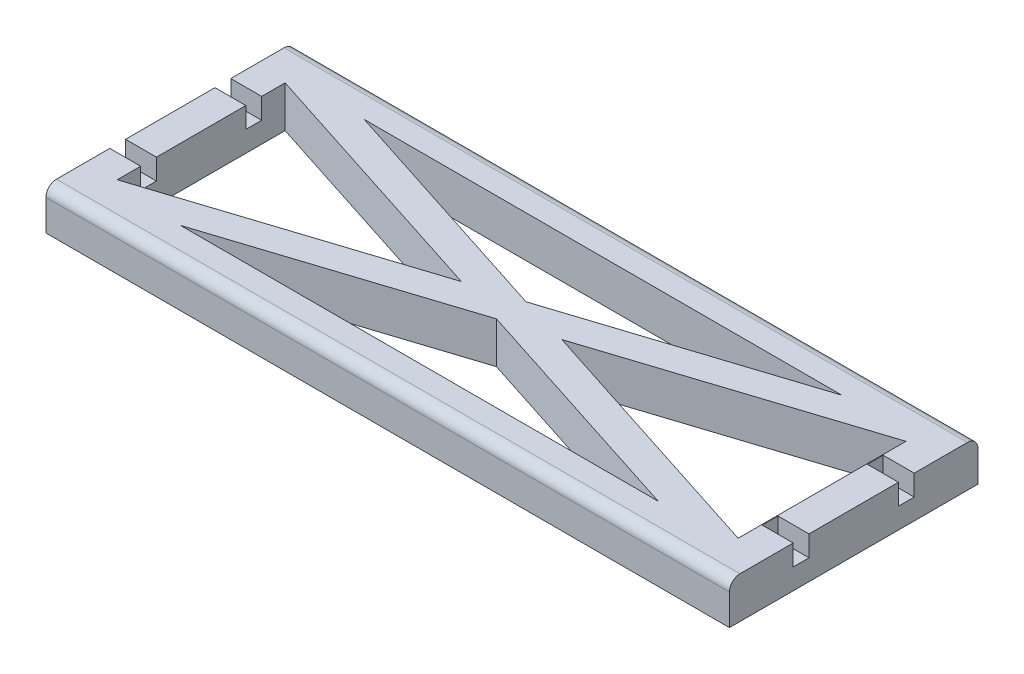
ISO-10303-21;
HEADER;
FILE_DESCRIPTION(('STEP AP214'),'2;1');
FILE_NAME('part.step','',(''),(''),'','','');
FILE_SCHEMA(('AUTOMOTIVE_DESIGN { 1 0 10303 214 1 1 1 1 }'));
ENDSEC;
DATA;
#1=APPLICATION_CONTEXT('core data for automotive mechanical design processes');
#2=APPLICATION_PROTOCOL_DEFINITION('international standard','automotive_design',2000,#1);
#3=PRODUCT_CONTEXT('',#1,'mechanical');
#4=PRODUCT('Part','Part','',(#3));
#5=PRODUCT_RELATED_PRODUCT_CATEGORY('part','',(#4));
#6=PRODUCT_DEFINITION_FORMATION('','',#4);
#7=PRODUCT_DEFINITION_CONTEXT('part definition',#1,'design');
#8=PRODUCT_DEFINITION('design','',#6,#7);
#9=PRODUCT_DEFINITION_SHAPE('','',#8);
#10=(LENGTH_UNIT() NAMED_UNIT(*) SI_UNIT(.MILLI.,.METRE.));
#11=(NAMED_UNIT(*) PLANE_ANGLE_UNIT() SI_UNIT($,.RADIAN.));
#12=(NAMED_UNIT(*) SI_UNIT($,.STERADIAN.) SOLID_ANGLE_UNIT());
#13=UNCERTAINTY_MEASURE_WITH_UNIT(LENGTH_MEASURE(1.E-05),#10,'distance_accuracy_value','');
#14=(GEOMETRIC_REPRESENTATION_CONTEXT(3) GLOBAL_UNCERTAINTY_ASSIGNED_CONTEXT((#13)) GLOBAL_UNIT_ASSIGNED_CONTEXT((#10,
#11,#12)) REPRESENTATION_CONTEXT('',''));
#15=CARTESIAN_POINT('',(0.,0.,0.));
#16=DIRECTION('',(0.,0.,1.));
#17=DIRECTION('',(1.,0.,0.));
#18=AXIS2_PLACEMENT_3D('',#15,#16,#17);
#19=CARTESIAN_POINT('',(82.5,10.,0.));
#20=DIRECTION('',(-1.,0.,0.));
#21=DIRECTION('',(0.,0.,1.));
#22=AXIS2_PLACEMENT_3D('',#19,#20,#21);
#23=PLANE('',#22);
#24=DIRECTION('',(0.,0.,-1.));
#25=VECTOR('',#24,1.);
#26=CARTESIAN_POINT('',(82.5,10.,0.));
#27=LINE('',#26,#25);
#28=CARTESIAN_POINT('',(82.5,10.,27.46));
#29=VERTEX_POINT('',#28);
#30=CARTESIAN_POINT('',(82.5,10.,14.605));
#31=VERTEX_POINT('',#30);
#32=EDGE_CURVE('E393',#29,#31,#27,.T.);
#33=ORIENTED_EDGE('',*,*,#32,.F.);
#34=CARTESIAN_POINT('',(82.5,7.46,27.46));
#35=DIRECTION('',(-1.,0.,0.));
#36=DIRECTION('',(0.,0.,1.));
#37=AXIS2_PLACEMENT_3D('',#34,#35,#36);
#38=CIRCLE('',#37,2.54);
#39=CARTESIAN_POINT('',(82.5,7.46,30.));
#40=VERTEX_POINT('',#39);
#41=EDGE_CURVE('E506',#29,#40,#38,.F.);
#42=ORIENTED_EDGE('',*,*,#41,.T.);
#43=DIRECTION('',(0.,-1.,0.));
#44=VECTOR('',#43,1.);
#45=CARTESIAN_POINT('',(82.5,10.,30.));
#46=LINE('',#45,#44);
#47=CARTESIAN_POINT('',(82.5,0.,30.));
#48=VERTEX_POINT('',#47);
#49=EDGE_CURVE('E464',#40,#48,#46,.T.);
#50=ORIENTED_EDGE('',*,*,#49,.T.);
#51=DIRECTION('',(0.,0.,-1.));
#52=VECTOR('',#51,1.);
#53=CARTESIAN_POINT('',(82.5,0.,0.));
#54=LINE('',#53,#52);
#55=CARTESIAN_POINT('',(82.5,0.,-30.));
#56=VERTEX_POINT('',#55);
#57=EDGE_CURVE('E436',#48,#56,#54,.T.);
#58=ORIENTED_EDGE('',*,*,#57,.T.);
#59=DIRECTION('',(0.,-1.,0.));
#60=VECTOR('',#59,1.);
#61=CARTESIAN_POINT('',(82.5,10.,-30.));
#62=LINE('',#61,#60);
#63=CARTESIAN_POINT('',(82.5,7.46,-30.));
#64=VERTEX_POINT('',#63);
#65=EDGE_CURVE('E459',#64,#56,#62,.T.);
#66=ORIENTED_EDGE('',*,*,#65,.F.);
#67=CARTESIAN_POINT('',(82.5,7.46,-27.46));
#68=DIRECTION('',(-1.,0.,0.));
#69=DIRECTION('',(0.,0.,1.));
#70=AXIS2_PLACEMENT_3D('',#67,#68,#69);
#71=CIRCLE('',#70,2.54);
#72=CARTESIAN_POINT('',(82.5,10.,-27.46));
#73=VERTEX_POINT('',#72);
#74=EDGE_CURVE('E504',#64,#73,#71,.F.);
#75=ORIENTED_EDGE('',*,*,#74,.T.);
#76=CARTESIAN_POINT('',(82.5,10.,-14.605));
#77=VERTEX_POINT('',#76);
#78=EDGE_CURVE('E392',#77,#73,#27,.T.);
#79=ORIENTED_EDGE('',*,*,#78,.F.);
#80=DIRECTION('',(0.,-1.,0.));
#81=VECTOR('',#80,1.);
#82=CARTESIAN_POINT('',(82.5,10.,-14.605));
#83=LINE('',#82,#81);
#84=CARTESIAN_POINT('',(82.5,5.,-14.605));
#85=VERTEX_POINT('',#84);
#86=EDGE_CURVE('E285',#77,#85,#83,.T.);
#87=ORIENTED_EDGE('',*,*,#86,.T.);
#88=DIRECTION('',(0.,0.,1.));
#89=VECTOR('',#88,1.);
#90=CARTESIAN_POINT('',(82.5,5.,-10.795));
#91=LINE('',#90,#89);
#92=CARTESIAN_POINT('',(82.5,5.,-10.795));
#93=VERTEX_POINT('',#92);
#94=EDGE_CURVE('E288',#85,#93,#91,.T.);
#95=ORIENTED_EDGE('',*,*,#94,.T.);
#96=DIRECTION('',(0.,1.,0.));
#97=VECTOR('',#96,1.);
#98=CARTESIAN_POINT('',(82.5,5.,-10.795));
#99=LINE('',#98,#97);
#100=CARTESIAN_POINT('',(82.5,10.,-10.795));
#101=VERTEX_POINT('',#100);
#102=EDGE_CURVE('E279',#93,#101,#99,.T.);
#103=ORIENTED_EDGE('',*,*,#102,.T.);
#104=CARTESIAN_POINT('',(82.5,10.,10.795));
#105=VERTEX_POINT('',#104);
#106=EDGE_CURVE('E396',#105,#101,#27,.T.);
#107=ORIENTED_EDGE('',*,*,#106,.F.);
#108=DIRECTION('',(0.,-1.,0.));
#109=VECTOR('',#108,1.);
#110=CARTESIAN_POINT('',(82.5,10.,10.795));
#111=LINE('',#110,#109);
#112=CARTESIAN_POINT('',(82.5,5.,10.795));
#113=VERTEX_POINT('',#112);
#114=EDGE_CURVE('E307',#105,#113,#111,.T.);
#115=ORIENTED_EDGE('',*,*,#114,.T.);
#116=DIRECTION('',(0.,0.,1.));
#117=VECTOR('',#116,1.);
#118=CARTESIAN_POINT('',(82.5,5.,14.605));
#119=LINE('',#118,#117);
#120=CARTESIAN_POINT('',(82.5,5.,14.605));
#121=VERTEX_POINT('',#120);
#122=EDGE_CURVE('E318',#113,#121,#119,.T.);
#123=ORIENTED_EDGE('',*,*,#122,.T.);
#124=DIRECTION('',(0.,1.,0.));
#125=VECTOR('',#124,1.);
#126=CARTESIAN_POINT('',(82.5,10.,14.605));
#127=LINE('',#126,#125);
#128=EDGE_CURVE('E315',#121,#31,#127,.T.);
#129=ORIENTED_EDGE('',*,*,#128,.T.);
#130=EDGE_LOOP('',(#33,#42,#50,#58,#66,#75,#79,#87,#95,#103,#107,#115,#123,#129));
#131=FACE_BOUND('',#130,.T.);
#132=ADVANCED_FACE('F41',(#131),#23,.F.);
#133=CARTESIAN_POINT('',(0.,10.,0.));
#134=DIRECTION('',(0.,1.,0.));
#135=DIRECTION('',(0.,0.,1.));
#136=AXIS2_PLACEMENT_3D('',#133,#134,#135);
#137=PLANE('',#136);
#138=DIRECTION('',(1.,0.,0.));
#139=VECTOR('',#138,1.);
#140=CARTESIAN_POINT('',(0.,10.,22.1658349914552));
#141=LINE('',#140,#139);
#142=CARTESIAN_POINT('',(-57.8346231707164,10.,22.1658349914552));
#143=VERTEX_POINT('',#142);
#144=CARTESIAN_POINT('',(57.4604582637845,10.,22.1658349914552));
#145=VERTEX_POINT('',#144);
#146=EDGE_CURVE('E367',#143,#145,#141,.T.);
#147=ORIENTED_EDGE('',*,*,#146,.F.);
#148=DIRECTION('',(0.951708617760551,0.,-0.307002779922759));
#149=VECTOR('',#148,1.);
#150=CARTESIAN_POINT('',(1.02539729526811,10.,3.17873161533114));
#151=LINE('',#150,#149);
#152=CARTESIAN_POINT('',(-0.187082453465993,10.,3.56985411492279));
#153=VERTEX_POINT('',#152);
#154=EDGE_CURVE('E370',#143,#153,#151,.T.);
#155=ORIENTED_EDGE('',*,*,#154,.T.);
#156=DIRECTION('',(0.951708617760551,0.,0.307002779922758));
#157=VECTOR('',#156,1.);
#158=CARTESIAN_POINT('',(-1.06066260223625,10.,3.28805406693238));
#159=LINE('',#158,#157);
#160=EDGE_CURVE('E373',#153,#145,#159,.T.);
#161=ORIENTED_EDGE('',*,*,#160,.T.);
#162=EDGE_LOOP('',(#147,#155,#161));
#163=FACE_BOUND('',#162,.T.);
#164=DIRECTION('',(-0.951708617760551,0.,0.307002779922759));
#165=VECTOR('',#164,1.);
#166=CARTESIAN_POINT('',(1.13471977655831,10.,3.51763130733076));
#167=LINE('',#166,#165);
#168=CARTESIAN_POINT('',(74.8529175465339,10.,-20.2624324894356));
#169=VERTEX_POINT('',#168);
#170=CARTESIAN_POINT('',(12.0393768292836,10.,0.));
#171=VERTEX_POINT('',#170);
#172=EDGE_CURVE('E375',#169,#171,#167,.T.);
#173=ORIENTED_EDGE('',*,*,#172,.F.);
#174=DIRECTION('',(0.,0.,1.));
#175=VECTOR('',#174,1.);
#176=CARTESIAN_POINT('',(74.8529175465339,10.,0.));
#177=LINE('',#176,#175);
#178=CARTESIAN_POINT('',(74.8529175465339,10.,20.2624324894356));
#179=VERTEX_POINT('',#178);
#180=EDGE_CURVE('E378',#169,#179,#177,.T.);
#181=ORIENTED_EDGE('',*,*,#180,.T.);
#182=DIRECTION('',(-0.951708617760551,0.,-0.307002779922759));
#183=VECTOR('',#182,1.);
#184=CARTESIAN_POINT('',(1.13471977655831,10.,-3.51763130733077));
#185=LINE('',#184,#183);
#186=EDGE_CURVE('E381',#179,#171,#185,.T.);
#187=ORIENTED_EDGE('',*,*,#186,.T.);
#188=EDGE_LOOP('',(#173,#181,#187));
#189=FACE_BOUND('',#188,.T.);
#190=DIRECTION('',(0.951708617760551,0.,-0.307002779922758));
#191=VECTOR('',#190,1.);
#192=CARTESIAN_POINT('',(-1.06066260223625,10.,-3.28805406693238));
#193=LINE('',#192,#191);
#194=CARTESIAN_POINT('',(-0.187082453465989,10.,-3.56985411492279));
#195=VERTEX_POINT('',#194);
#196=CARTESIAN_POINT('',(57.4604582637846,10.,-22.1658349914552));
#197=VERTEX_POINT('',#196);
#198=EDGE_CURVE('E383',#195,#197,#193,.T.);
#199=ORIENTED_EDGE('',*,*,#198,.F.);
#200=DIRECTION('',(0.951708617760551,0.,0.307002779922759));
#201=VECTOR('',#200,1.);
#202=CARTESIAN_POINT('',(1.02539729526811,10.,-3.17873161533114));
#203=LINE('',#202,#201);
#204=CARTESIAN_POINT('',(-57.8346231707164,10.,-22.1658349914552));
#205=VERTEX_POINT('',#204);
#206=EDGE_CURVE('E386',#205,#195,#203,.T.);
#207=ORIENTED_EDGE('',*,*,#206,.F.);
#208=DIRECTION('',(-1.,0.,0.));
#209=VECTOR('',#208,1.);
#210=CARTESIAN_POINT('',(0.,10.,-22.1658349914552));
#211=LINE('',#210,#209);
#212=EDGE_CURVE('E389',#197,#205,#211,.T.);
#213=ORIENTED_EDGE('',*,*,#212,.F.);
#214=EDGE_LOOP('',(#199,#207,#213));
#215=FACE_BOUND('',#214,.T.);
#216=DIRECTION('',(0.,0.,1.));
#217=VECTOR('',#216,1.);
#218=CARTESIAN_POINT('',(-82.5,10.,0.));
#219=LINE('',#218,#217);
#220=CARTESIAN_POINT('',(-82.5,10.,14.605));
#221=VERTEX_POINT('',#220);
#222=CARTESIAN_POINT('',(-82.5,10.,27.46));
#223=VERTEX_POINT('',#222);
#224=EDGE_CURVE('E395',#221,#223,#219,.T.);
#225=ORIENTED_EDGE('',*,*,#224,.T.);
#226=DIRECTION('',(1.,0.,0.));
#227=VECTOR('',#226,1.);
#228=CARTESIAN_POINT('',(82.5,10.,27.46));
#229=LINE('',#228,#227);
#230=EDGE_CURVE('E501',#223,#29,#229,.T.);
#231=ORIENTED_EDGE('',*,*,#230,.T.);
#232=ORIENTED_EDGE('',*,*,#32,.T.);
#233=DIRECTION('',(1.,0.,0.));
#234=VECTOR('',#233,1.);
#235=CARTESIAN_POINT('',(75.,10.,14.605));
#236=LINE('',#235,#234);
#237=CARTESIAN_POINT('',(75.,10.,14.605));
#238=VERTEX_POINT('',#237);
#239=EDGE_CURVE('E294',#238,#31,#236,.T.);
#240=ORIENTED_EDGE('',*,*,#239,.F.);
#241=DIRECTION('',(0.,0.,-1.));
#242=VECTOR('',#241,1.);
#243=CARTESIAN_POINT('',(75.,10.,14.605));
#244=LINE('',#243,#242);
#245=CARTESIAN_POINT('',(75.,10.,10.795));
#246=VERTEX_POINT('',#245);
#247=EDGE_CURVE('E311',#238,#246,#244,.T.);
#248=ORIENTED_EDGE('',*,*,#247,.T.);
#249=DIRECTION('',(1.,0.,0.));
#250=VECTOR('',#249,1.);
#251=CARTESIAN_POINT('',(75.,10.,10.795));
#252=LINE('',#251,#250);
#253=EDGE_CURVE('E325',#246,#105,#252,.T.);
#254=ORIENTED_EDGE('',*,*,#253,.T.);
#255=ORIENTED_EDGE('',*,*,#106,.T.);
#256=DIRECTION('',(1.,0.,0.));
#257=VECTOR('',#256,1.);
#258=CARTESIAN_POINT('',(75.,10.,-10.795));
#259=LINE('',#258,#257);
#260=CARTESIAN_POINT('',(75.,10.,-10.795));
#261=VERTEX_POINT('',#260);
#262=EDGE_CURVE('E296',#261,#101,#259,.T.);
#263=ORIENTED_EDGE('',*,*,#262,.F.);
#264=DIRECTION('',(0.,0.,-1.));
#265=VECTOR('',#264,1.);
#266=CARTESIAN_POINT('',(75.,10.,-14.605));
#267=LINE('',#266,#265);
#268=CARTESIAN_POINT('',(75.,10.,-14.605));
#269=VERTEX_POINT('',#268);
#270=EDGE_CURVE('E281',#261,#269,#267,.T.);
#271=ORIENTED_EDGE('',*,*,#270,.T.);
#272=DIRECTION('',(1.,0.,0.));
#273=VECTOR('',#272,1.);
#274=CARTESIAN_POINT('',(75.,10.,-14.605));
#275=LINE('',#274,#273);
#276=EDGE_CURVE('E299',#269,#77,#275,.T.);
#277=ORIENTED_EDGE('',*,*,#276,.T.);
#278=ORIENTED_EDGE('',*,*,#78,.T.);
#279=DIRECTION('',(-1.,0.,0.));
#280=VECTOR('',#279,1.);
#281=CARTESIAN_POINT('',(-82.5,10.,-27.46));
#282=LINE('',#281,#280);
#283=CARTESIAN_POINT('',(-82.5,10.,-27.46));
#284=VERTEX_POINT('',#283);
#285=EDGE_CURVE('E498',#73,#284,#282,.T.);
#286=ORIENTED_EDGE('',*,*,#285,.T.);
#287=CARTESIAN_POINT('',(-82.5,10.,-14.605));
#288=VERTEX_POINT('',#287);
#289=EDGE_CURVE('E397',#284,#288,#219,.T.);
#290=ORIENTED_EDGE('',*,*,#289,.T.);
#291=DIRECTION('',(-1.,0.,0.));
#292=VECTOR('',#291,1.);
#293=CARTESIAN_POINT('',(0.,10.,-14.605));
#294=LINE('',#293,#292);
#295=CARTESIAN_POINT('',(-75.04,10.,-14.605));
#296=VERTEX_POINT('',#295);
#297=EDGE_CURVE('E493',#296,#288,#294,.T.);
#298=ORIENTED_EDGE('',*,*,#297,.F.);
#299=DIRECTION('',(0.,0.,1.));
#300=VECTOR('',#299,1.);
#301=CARTESIAN_POINT('',(-75.04,10.,0.));
#302=LINE('',#301,#300);
#303=CARTESIAN_POINT('',(-75.04,10.,-20.2624324894356));
#304=VERTEX_POINT('',#303);
#305=EDGE_CURVE('E401',#304,#296,#302,.T.);
#306=ORIENTED_EDGE('',*,*,#305,.F.);
#307=DIRECTION('',(0.951708617760551,0.,0.307002779922758));
#308=VECTOR('',#307,1.);
#309=CARTESIAN_POINT('',(-1.15235243004238,10.,3.57229253313137));
#310=LINE('',#309,#308);
#311=CARTESIAN_POINT('',(-12.2264592827496,10.,0.));
#312=VERTEX_POINT('',#311);
#313=EDGE_CURVE('E404',#304,#312,#310,.T.);
#314=ORIENTED_EDGE('',*,*,#313,.T.);
#315=DIRECTION('',(0.951708617760551,0.,-0.307002779922759));
#316=VECTOR('',#315,1.);
#317=CARTESIAN_POINT('',(-1.15235243004238,10.,-3.57229253313138));
#318=LINE('',#317,#316);
#319=CARTESIAN_POINT('',(-75.04,10.,20.2624324894356));
#320=VERTEX_POINT('',#319);
#321=EDGE_CURVE('E407',#320,#312,#318,.T.);
#322=ORIENTED_EDGE('',*,*,#321,.F.);
#323=CARTESIAN_POINT('',(-75.04,10.,14.605));
#324=VERTEX_POINT('',#323);
#325=EDGE_CURVE('E399',#324,#320,#302,.T.);
#326=ORIENTED_EDGE('',*,*,#325,.F.);
#327=DIRECTION('',(1.,0.,0.));
#328=VECTOR('',#327,1.);
#329=CARTESIAN_POINT('',(0.,10.,14.605));
#330=LINE('',#329,#328);
#331=EDGE_CURVE('E491',#221,#324,#330,.T.);
#332=ORIENTED_EDGE('',*,*,#331,.F.);
#333=EDGE_LOOP('',(#225,#231,#232,#240,#248,#254,#255,#263,#271,#277,#278,#286,#290,#298,#306,
#314,#322,#326,#332));
#334=FACE_BOUND('',#333,.T.);
#335=ADVANCED_FACE('F518',(#163,#189,#215,#334),#137,.T.);
#336=DIRECTION('',(1.,0.,0.));
#337=VECTOR('',#336,1.);
#338=CARTESIAN_POINT('',(0.,10.,-10.795));
#339=LINE('',#338,#337);
#340=CARTESIAN_POINT('',(-82.5,10.,-10.795));
#341=VERTEX_POINT('',#340);
#342=CARTESIAN_POINT('',(-75.04,10.,-10.795));
#343=VERTEX_POINT('',#342);
#344=EDGE_CURVE('E496',#341,#343,#339,.T.);
#345=ORIENTED_EDGE('',*,*,#344,.F.);
#346=CARTESIAN_POINT('',(-82.5,10.,10.795));
#347=VERTEX_POINT('',#346);
#348=EDGE_CURVE('E400',#341,#347,#219,.T.);
#349=ORIENTED_EDGE('',*,*,#348,.T.);
#350=DIRECTION('',(-1.,0.,0.));
#351=VECTOR('',#350,1.);
#352=CARTESIAN_POINT('',(0.,10.,10.795));
#353=LINE('',#352,#351);
#354=CARTESIAN_POINT('',(-75.04,10.,10.795));
#355=VERTEX_POINT('',#354);
#356=EDGE_CURVE('E463',#355,#347,#353,.T.);
#357=ORIENTED_EDGE('',*,*,#356,.F.);
#358=EDGE_CURVE('E405',#343,#355,#302,.T.);
#359=ORIENTED_EDGE('',*,*,#358,.F.);
#360=EDGE_LOOP('',(#345,#349,#357,#359));
#361=FACE_BOUND('',#360,.T.);
#362=ADVANCED_FACE('F586',(#361),#137,.T.);
#363=CARTESIAN_POINT('',(-75.04,10.,0.));
#364=DIRECTION('',(1.,0.,0.));
#365=DIRECTION('',(0.,0.,-1.));
#366=AXIS2_PLACEMENT_3D('',#363,#364,#365);
#367=PLANE('',#366);
#368=DIRECTION('',(0.,-1.,0.));
#369=VECTOR('',#368,1.);
#370=CARTESIAN_POINT('',(-75.04,10.,-10.795));
#371=LINE('',#370,#369);
#372=CARTESIAN_POINT('',(-75.04,5.,-10.795));
#373=VERTEX_POINT('',#372);
#374=EDGE_CURVE('E360',#343,#373,#371,.T.);
#375=ORIENTED_EDGE('',*,*,#374,.F.);
#376=ORIENTED_EDGE('',*,*,#358,.T.);
#377=DIRECTION('',(0.,1.,0.));
#378=VECTOR('',#377,1.);
#379=CARTESIAN_POINT('',(-75.04,10.,10.795));
#380=LINE('',#379,#378);
#381=CARTESIAN_POINT('',(-75.04,5.,10.795));
#382=VERTEX_POINT('',#381);
#383=EDGE_CURVE('E343',#382,#355,#380,.T.);
#384=ORIENTED_EDGE('',*,*,#383,.F.);
#385=DIRECTION('',(0.,0.,-1.));
#386=VECTOR('',#385,1.);
#387=CARTESIAN_POINT('',(-75.04,5.,0.));
#388=LINE('',#387,#386);
#389=CARTESIAN_POINT('',(-75.04,5.,14.605));
#390=VERTEX_POINT('',#389);
#391=EDGE_CURVE('E362',#390,#382,#388,.T.);
#392=ORIENTED_EDGE('',*,*,#391,.F.);
#393=DIRECTION('',(0.,-1.,0.));
#394=VECTOR('',#393,1.);
#395=CARTESIAN_POINT('',(-75.04,10.,14.605));
#396=LINE('',#395,#394);
#397=EDGE_CURVE('E356',#324,#390,#396,.T.);
#398=ORIENTED_EDGE('',*,*,#397,.F.);
#399=ORIENTED_EDGE('',*,*,#325,.T.);
#400=DIRECTION('',(0.,-1.,0.));
#401=VECTOR('',#400,1.);
#402=CARTESIAN_POINT('',(-75.04,10.,20.2624324894356));
#403=LINE('',#402,#401);
#404=CARTESIAN_POINT('',(-75.04,0.,20.2624324894356));
#405=VERTEX_POINT('',#404);
#406=EDGE_CURVE('E456',#320,#405,#403,.T.);
#407=ORIENTED_EDGE('',*,*,#406,.T.);
#408=DIRECTION('',(0.,0.,1.));
#409=VECTOR('',#408,1.);
#410=CARTESIAN_POINT('',(-75.04,0.,0.));
#411=LINE('',#410,#409);
#412=CARTESIAN_POINT('',(-75.04,0.,-20.2624324894356));
#413=VERTEX_POINT('',#412);
#414=EDGE_CURVE('E448',#413,#405,#411,.T.);
#415=ORIENTED_EDGE('',*,*,#414,.F.);
#416=DIRECTION('',(0.,-1.,0.));
#417=VECTOR('',#416,1.);
#418=CARTESIAN_POINT('',(-75.04,10.,-20.2624324894356));
#419=LINE('',#418,#417);
#420=EDGE_CURVE('E461',#304,#413,#419,.T.);
#421=ORIENTED_EDGE('',*,*,#420,.F.);
#422=ORIENTED_EDGE('',*,*,#305,.T.);
#423=DIRECTION('',(0.,1.,0.));
#424=VECTOR('',#423,1.);
#425=CARTESIAN_POINT('',(-75.04,10.,-14.605));
#426=LINE('',#425,#424);
#427=CARTESIAN_POINT('',(-75.04,5.,-14.605));
#428=VERTEX_POINT('',#427);
#429=EDGE_CURVE('E358',#428,#296,#426,.T.);
#430=ORIENTED_EDGE('',*,*,#429,.F.);
#431=DIRECTION('',(0.,0.,-1.));
#432=VECTOR('',#431,1.);
#433=CARTESIAN_POINT('',(-75.04,5.,0.));
#434=LINE('',#433,#432);
#435=EDGE_CURVE('E364',#373,#428,#434,.T.);
#436=ORIENTED_EDGE('',*,*,#435,.F.);
#437=EDGE_LOOP('',(#375,#376,#384,#392,#398,#399,#407,#415,#421,#422,#430,#436));
#438=FACE_BOUND('',#437,.T.);
#439=ADVANCED_FACE('F550',(#438),#367,.T.);
#440=CARTESIAN_POINT('',(-1.15235243004238,10.,3.57229253313137));
#441=DIRECTION('',(0.307002779922758,0.,-0.951708617760551));
#442=DIRECTION('',(-0.951708617760551,0.,-0.307002779922758));
#443=AXIS2_PLACEMENT_3D('',#440,#441,#442);
#444=PLANE('',#443);
#445=DIRECTION('',(0.951708617760551,0.,0.307002779922758));
#446=VECTOR('',#445,1.);
#447=CARTESIAN_POINT('',(-1.15235243004238,0.,3.57229253313137));
#448=LINE('',#447,#446);
#449=CARTESIAN_POINT('',(-12.2264592827496,0.,0.));
#450=VERTEX_POINT('',#449);
#451=EDGE_CURVE('E451',#413,#450,#448,.T.);
#452=ORIENTED_EDGE('',*,*,#451,.T.);
#453=DIRECTION('',(0.,-1.,0.));
#454=VECTOR('',#453,1.);
#455=CARTESIAN_POINT('',(-12.2264592827496,10.,0.));
#456=LINE('',#455,#454);
#457=EDGE_CURVE('E458',#312,#450,#456,.T.);
#458=ORIENTED_EDGE('',*,*,#457,.F.);
#459=ORIENTED_EDGE('',*,*,#313,.F.);
#460=ORIENTED_EDGE('',*,*,#420,.T.);
#461=EDGE_LOOP('',(#452,#458,#459,#460));
#462=FACE_BOUND('',#461,.T.);
#463=ADVANCED_FACE('F557',(#462),#444,.F.);
#464=CARTESIAN_POINT('',(0.,10.,-30.));
#465=DIRECTION('',(0.,0.,1.));
#466=DIRECTION('',(1.,0.,0.));
#467=AXIS2_PLACEMENT_3D('',#464,#465,#466);
#468=PLANE('',#467);
#469=DIRECTION('',(0.,-1.,0.));
#470=VECTOR('',#469,1.);
#471=CARTESIAN_POINT('',(-82.5,10.,-30.));
#472=LINE('',#471,#470);
#473=CARTESIAN_POINT('',(-82.5,7.46,-30.));
#474=VERTEX_POINT('',#473);
#475=CARTESIAN_POINT('',(-82.5,0.,-30.));
#476=VERTEX_POINT('',#475);
#477=EDGE_CURVE('E469',#474,#476,#472,.T.);
#478=ORIENTED_EDGE('',*,*,#477,.F.);
#479=DIRECTION('',(-1.,0.,0.));
#480=VECTOR('',#479,1.);
#481=CARTESIAN_POINT('',(82.5,7.46,-30.));
#482=LINE('',#481,#480);
#483=EDGE_CURVE('E11',#474,#64,#482,.F.);
#484=ORIENTED_EDGE('',*,*,#483,.T.);
#485=ORIENTED_EDGE('',*,*,#65,.T.);
#486=DIRECTION('',(-1.,0.,0.));
#487=VECTOR('',#486,1.);
#488=CARTESIAN_POINT('',(0.,0.,-30.));
#489=LINE('',#488,#487);
#490=EDGE_CURVE('E439',#56,#476,#489,.T.);
#491=ORIENTED_EDGE('',*,*,#490,.T.);
#492=EDGE_LOOP('',(#478,#484,#485,#491));
#493=FACE_BOUND('',#492,.T.);
#494=ADVANCED_FACE('F590',(#493),#468,.F.);
#495=CARTESIAN_POINT('',(-82.5,10.,0.));
#496=DIRECTION('',(1.,0.,0.));
#497=DIRECTION('',(0.,0.,-1.));
#498=AXIS2_PLACEMENT_3D('',#495,#496,#497);
#499=PLANE('',#498);
#500=DIRECTION('',(0.,-1.,0.));
#501=VECTOR('',#500,1.);
#502=CARTESIAN_POINT('',(-82.5,10.,30.));
#503=LINE('',#502,#501);
#504=CARTESIAN_POINT('',(-82.5,7.46,30.));
#505=VERTEX_POINT('',#504);
#506=CARTESIAN_POINT('',(-82.5,0.,30.));
#507=VERTEX_POINT('',#506);
#508=EDGE_CURVE('E466',#505,#507,#503,.T.);
#509=ORIENTED_EDGE('',*,*,#508,.F.);
#510=CARTESIAN_POINT('',(-82.5,7.46,27.46));
#511=DIRECTION('',(1.,0.,0.));
#512=DIRECTION('',(0.,0.,-1.));
#513=AXIS2_PLACEMENT_3D('',#510,#511,#512);
#514=CIRCLE('',#513,2.54);
#515=EDGE_CURVE('E49',#505,#223,#514,.F.);
#516=ORIENTED_EDGE('',*,*,#515,.T.);
#517=ORIENTED_EDGE('',*,*,#224,.F.);
#518=DIRECTION('',(0.,1.,0.));
#519=VECTOR('',#518,1.);
#520=CARTESIAN_POINT('',(-82.5,10.,14.605));
#521=LINE('',#520,#519);
#522=CARTESIAN_POINT('',(-82.5,5.,14.605));
#523=VERTEX_POINT('',#522);
#524=EDGE_CURVE('E334',#523,#221,#521,.T.);
#525=ORIENTED_EDGE('',*,*,#524,.F.);
#526=DIRECTION('',(0.,0.,1.));
#527=VECTOR('',#526,1.);
#528=CARTESIAN_POINT('',(-82.5,5.,14.605));
#529=LINE('',#528,#527);
#530=CARTESIAN_POINT('',(-82.5,5.,10.795));
#531=VERTEX_POINT('',#530);
#532=EDGE_CURVE('E347',#531,#523,#529,.T.);
#533=ORIENTED_EDGE('',*,*,#532,.F.);
#534=DIRECTION('',(0.,-1.,0.));
#535=VECTOR('',#534,1.);
#536=CARTESIAN_POINT('',(-82.5,10.,10.795));
#537=LINE('',#536,#535);
#538=EDGE_CURVE('E351',#347,#531,#537,.T.);
#539=ORIENTED_EDGE('',*,*,#538,.F.);
#540=ORIENTED_EDGE('',*,*,#348,.F.);
#541=DIRECTION('',(0.,1.,0.));
#542=VECTOR('',#541,1.);
#543=CARTESIAN_POINT('',(-82.5,5.,-10.795));
#544=LINE('',#543,#542);
#545=CARTESIAN_POINT('',(-82.5,5.,-10.795));
#546=VERTEX_POINT('',#545);
#547=EDGE_CURVE('E331',#546,#341,#544,.T.);
#548=ORIENTED_EDGE('',*,*,#547,.F.);
#549=DIRECTION('',(0.,0.,1.));
#550=VECTOR('',#549,1.);
#551=CARTESIAN_POINT('',(-82.5,5.,-10.795));
#552=LINE('',#551,#550);
#553=CARTESIAN_POINT('',(-82.5,5.,-14.605));
#554=VERTEX_POINT('',#553);
#555=EDGE_CURVE('E337',#554,#546,#552,.T.);
#556=ORIENTED_EDGE('',*,*,#555,.F.);
#557=DIRECTION('',(0.,-1.,0.));
#558=VECTOR('',#557,1.);
#559=CARTESIAN_POINT('',(-82.5,10.,-14.605));
#560=LINE('',#559,#558);
#561=EDGE_CURVE('E333',#288,#554,#560,.T.);
#562=ORIENTED_EDGE('',*,*,#561,.F.);
#563=ORIENTED_EDGE('',*,*,#289,.F.);
#564=CARTESIAN_POINT('',(-82.5,7.46,-27.46));
#565=DIRECTION('',(1.,0.,0.));
#566=DIRECTION('',(0.,0.,-1.));
#567=AXIS2_PLACEMENT_3D('',#564,#565,#566);
#568=CIRCLE('',#567,2.54);
#569=EDGE_CURVE('E56',#284,#474,#568,.F.);
#570=ORIENTED_EDGE('',*,*,#569,.T.);
#571=ORIENTED_EDGE('',*,*,#477,.T.);
#572=DIRECTION('',(0.,0.,1.));
#573=VECTOR('',#572,1.);
#574=CARTESIAN_POINT('',(-82.5,0.,0.));
#575=LINE('',#574,#573);
#576=EDGE_CURVE('E442',#476,#507,#575,.T.);
#577=ORIENTED_EDGE('',*,*,#576,.T.);
#578=EDGE_LOOP('',(#509,#516,#517,#525,#533,#539,#540,#548,#556,#562,#563,#570,#571,#577));
#579=FACE_BOUND('',#578,.T.);
#580=ADVANCED_FACE('F512',(#579),#499,.F.);
#581=CARTESIAN_POINT('',(-1.06066260223625,10.,-3.28805406693238));
#582=DIRECTION('',(-0.307002779922758,0.,-0.951708617760551));
#583=DIRECTION('',(-0.951708617760551,0.,0.307002779922758));
#584=AXIS2_PLACEMENT_3D('',#581,#582,#583);
#585=PLANE('',#584);
#586=DIRECTION('',(0.951708617760551,0.,-0.307002779922758));
#587=VECTOR('',#586,1.);
#588=CARTESIAN_POINT('',(-1.06066260223625,0.,-3.28805406693238));
#589=LINE('',#588,#587);
#590=CARTESIAN_POINT('',(-0.187082453465989,0.,-3.56985411492279));
#591=VERTEX_POINT('',#590);
#592=CARTESIAN_POINT('',(57.4604582637846,0.,-22.1658349914552));
#593=VERTEX_POINT('',#592);
#594=EDGE_CURVE('E427',#591,#593,#589,.T.);
#595=ORIENTED_EDGE('',*,*,#594,.F.);
#596=DIRECTION('',(0.,-1.,0.));
#597=VECTOR('',#596,1.);
#598=CARTESIAN_POINT('',(-0.187082453465989,10.,-3.56985411492279));
#599=LINE('',#598,#597);
#600=EDGE_CURVE('E467',#195,#591,#599,.T.);
#601=ORIENTED_EDGE('',*,*,#600,.F.);
#602=ORIENTED_EDGE('',*,*,#198,.T.);
#603=DIRECTION('',(0.,-1.,0.));
#604=VECTOR('',#603,1.);
#605=CARTESIAN_POINT('',(57.4604582637846,10.,-22.1658349914552));
#606=LINE('',#605,#604);
#607=EDGE_CURVE('E472',#197,#593,#606,.T.);
#608=ORIENTED_EDGE('',*,*,#607,.T.);
#609=EDGE_LOOP('',(#595,#601,#602,#608));
#610=FACE_BOUND('',#609,.T.);
#611=ADVANCED_FACE('F601',(#610),#585,.T.);
#612=CARTESIAN_POINT('',(1.02539729526811,10.,-3.17873161533114));
#613=DIRECTION('',(0.307002779922759,0.,-0.951708617760551));
#614=DIRECTION('',(-0.951708617760551,0.,-0.307002779922759));
#615=AXIS2_PLACEMENT_3D('',#612,#613,#614);
#616=PLANE('',#615);
#617=DIRECTION('',(0.951708617760551,0.,0.307002779922759));
#618=VECTOR('',#617,1.);
#619=CARTESIAN_POINT('',(1.02539729526811,0.,-3.17873161533114));
#620=LINE('',#619,#618);
#621=CARTESIAN_POINT('',(-57.8346231707164,0.,-22.1658349914552));
#622=VERTEX_POINT('',#621);
#623=EDGE_CURVE('E430',#622,#591,#620,.T.);
#624=ORIENTED_EDGE('',*,*,#623,.F.);
#625=DIRECTION('',(0.,-1.,0.));
#626=VECTOR('',#625,1.);
#627=CARTESIAN_POINT('',(-57.8346231707164,10.,-22.1658349914552));
#628=LINE('',#627,#626);
#629=EDGE_CURVE('E474',#205,#622,#628,.T.);
#630=ORIENTED_EDGE('',*,*,#629,.F.);
#631=ORIENTED_EDGE('',*,*,#206,.T.);
#632=ORIENTED_EDGE('',*,*,#600,.T.);
#633=EDGE_LOOP('',(#624,#630,#631,#632));
#634=FACE_BOUND('',#633,.T.);
#635=ADVANCED_FACE('F597',(#634),#616,.T.);
#636=CARTESIAN_POINT('',(1.13471977655831,10.,3.51763130733076));
#637=DIRECTION('',(0.307002779922759,0.,0.951708617760551));
#638=DIRECTION('',(0.951708617760551,0.,-0.307002779922759));
#639=AXIS2_PLACEMENT_3D('',#636,#637,#638);
#640=PLANE('',#639);
#641=DIRECTION('',(-0.951708617760551,0.,0.307002779922759));
#642=VECTOR('',#641,1.);
#643=CARTESIAN_POINT('',(1.13471977655831,0.,3.51763130733076));
#644=LINE('',#643,#642);
#645=CARTESIAN_POINT('',(74.8529175465339,0.,-20.2624324894356));
#646=VERTEX_POINT('',#645);
#647=CARTESIAN_POINT('',(12.0393768292836,0.,0.));
#648=VERTEX_POINT('',#647);
#649=EDGE_CURVE('E418',#646,#648,#644,.T.);
#650=ORIENTED_EDGE('',*,*,#649,.F.);
#651=DIRECTION('',(0.,-1.,0.));
#652=VECTOR('',#651,1.);
#653=CARTESIAN_POINT('',(74.8529175465339,10.,-20.2624324894356));
#654=LINE('',#653,#652);
#655=EDGE_CURVE('E475',#169,#646,#654,.T.);
#656=ORIENTED_EDGE('',*,*,#655,.F.);
#657=ORIENTED_EDGE('',*,*,#172,.T.);
#658=DIRECTION('',(0.,-1.,0.));
#659=VECTOR('',#658,1.);
#660=CARTESIAN_POINT('',(12.0393768292836,10.,0.));
#661=LINE('',#660,#659);
#662=EDGE_CURVE('E478',#171,#648,#661,.T.);
#663=ORIENTED_EDGE('',*,*,#662,.T.);
#664=EDGE_LOOP('',(#650,#656,#657,#663));
#665=FACE_BOUND('',#664,.T.);
#666=ADVANCED_FACE('F600',(#665),#640,.T.);
#667=CARTESIAN_POINT('',(74.8529175465339,10.,0.));
#668=DIRECTION('',(1.,0.,0.));
#669=DIRECTION('',(0.,0.,-1.));
#670=AXIS2_PLACEMENT_3D('',#667,#668,#669);
#671=PLANE('',#670);
#672=DIRECTION('',(0.,0.,1.));
#673=VECTOR('',#672,1.);
#674=CARTESIAN_POINT('',(74.8529175465339,0.,0.));
#675=LINE('',#674,#673);
#676=CARTESIAN_POINT('',(74.8529175465339,0.,20.2624324894356));
#677=VERTEX_POINT('',#676);
#678=EDGE_CURVE('E421',#646,#677,#675,.T.);
#679=ORIENTED_EDGE('',*,*,#678,.T.);
#680=DIRECTION('',(0.,-1.,0.));
#681=VECTOR('',#680,1.);
#682=CARTESIAN_POINT('',(74.8529175465339,10.,20.2624324894356));
#683=LINE('',#682,#681);
#684=EDGE_CURVE('E480',#179,#677,#683,.T.);
#685=ORIENTED_EDGE('',*,*,#684,.F.);
#686=ORIENTED_EDGE('',*,*,#180,.F.);
#687=ORIENTED_EDGE('',*,*,#655,.T.);
#688=EDGE_LOOP('',(#679,#685,#686,#687));
#689=FACE_BOUND('',#688,.T.);
#690=ADVANCED_FACE('F609',(#689),#671,.F.);
#691=CARTESIAN_POINT('',(0.,10.,22.1658349914552));
#692=DIRECTION('',(0.,0.,-1.));
#693=DIRECTION('',(-1.,0.,0.));
#694=AXIS2_PLACEMENT_3D('',#691,#692,#693);
#695=PLANE('',#694);
#696=DIRECTION('',(1.,0.,0.));
#697=VECTOR('',#696,1.);
#698=CARTESIAN_POINT('',(0.,0.,22.1658349914552));
#699=LINE('',#698,#697);
#700=CARTESIAN_POINT('',(-57.8346231707164,0.,22.1658349914552));
#701=VERTEX_POINT('',#700);
#702=CARTESIAN_POINT('',(57.4604582637845,0.,22.1658349914552));
#703=VERTEX_POINT('',#702);
#704=EDGE_CURVE('E366',#701,#703,#699,.T.);
#705=ORIENTED_EDGE('',*,*,#704,.F.);
#706=DIRECTION('',(0.,-1.,0.));
#707=VECTOR('',#706,1.);
#708=CARTESIAN_POINT('',(-57.8346231707164,10.,22.1658349914552));
#709=LINE('',#708,#707);
#710=EDGE_CURVE('E481',#143,#701,#709,.T.);
#711=ORIENTED_EDGE('',*,*,#710,.F.);
#712=ORIENTED_EDGE('',*,*,#146,.T.);
#713=DIRECTION('',(0.,-1.,0.));
#714=VECTOR('',#713,1.);
#715=CARTESIAN_POINT('',(57.4604582637845,10.,22.1658349914552));
#716=LINE('',#715,#714);
#717=EDGE_CURVE('E410',#145,#703,#716,.T.);
#718=ORIENTED_EDGE('',*,*,#717,.T.);
#719=EDGE_LOOP('',(#705,#711,#712,#718));
#720=FACE_BOUND('',#719,.T.);
#721=ADVANCED_FACE('F612',(#720),#695,.T.);
#722=CARTESIAN_POINT('',(1.02539729526811,10.,3.17873161533114));
#723=DIRECTION('',(-0.307002779922759,0.,-0.951708617760551));
#724=DIRECTION('',(-0.951708617760551,0.,0.307002779922759));
#725=AXIS2_PLACEMENT_3D('',#722,#723,#724);
#726=PLANE('',#725);
#727=DIRECTION('',(0.951708617760551,0.,-0.307002779922759));
#728=VECTOR('',#727,1.);
#729=CARTESIAN_POINT('',(1.02539729526811,0.,3.17873161533114));
#730=LINE('',#729,#728);
#731=CARTESIAN_POINT('',(-0.187082453465993,0.,3.56985411492279));
#732=VERTEX_POINT('',#731);
#733=EDGE_CURVE('E413',#701,#732,#730,.T.);
#734=ORIENTED_EDGE('',*,*,#733,.T.);
#735=DIRECTION('',(0.,-1.,0.));
#736=VECTOR('',#735,1.);
#737=CARTESIAN_POINT('',(-0.187082453465993,10.,3.56985411492279));
#738=LINE('',#737,#736);
#739=EDGE_CURVE('E486',#153,#732,#738,.T.);
#740=ORIENTED_EDGE('',*,*,#739,.F.);
#741=ORIENTED_EDGE('',*,*,#154,.F.);
#742=ORIENTED_EDGE('',*,*,#710,.T.);
#743=EDGE_LOOP('',(#734,#740,#741,#742));
#744=FACE_BOUND('',#743,.T.);
#745=ADVANCED_FACE('F620',(#744),#726,.F.);
#746=CARTESIAN_POINT('',(0.,10.,30.));
#747=DIRECTION('',(0.,0.,-1.));
#748=DIRECTION('',(-1.,0.,0.));
#749=AXIS2_PLACEMENT_3D('',#746,#747,#748);
#750=PLANE('',#749);
#751=ORIENTED_EDGE('',*,*,#49,.F.);
#752=DIRECTION('',(1.,0.,0.));
#753=VECTOR('',#752,1.);
#754=CARTESIAN_POINT('',(-82.5,7.46,30.));
#755=LINE('',#754,#753);
#756=EDGE_CURVE('E64',#40,#505,#755,.F.);
#757=ORIENTED_EDGE('',*,*,#756,.T.);
#758=ORIENTED_EDGE('',*,*,#508,.T.);
#759=DIRECTION('',(1.,0.,0.));
#760=VECTOR('',#759,1.);
#761=CARTESIAN_POINT('',(0.,0.,30.));
#762=LINE('',#761,#760);
#763=EDGE_CURVE('E445',#507,#48,#762,.T.);
#764=ORIENTED_EDGE('',*,*,#763,.T.);
#765=EDGE_LOOP('',(#751,#757,#758,#764));
#766=FACE_BOUND('',#765,.T.);
#767=ADVANCED_FACE('F523',(#766),#750,.F.);
#768=CARTESIAN_POINT('',(0.,10.,-22.1658349914552));
#769=DIRECTION('',(0.,0.,1.));
#770=DIRECTION('',(1.,0.,0.));
#771=AXIS2_PLACEMENT_3D('',#768,#769,#770);
#772=PLANE('',#771);
#773=DIRECTION('',(-1.,0.,0.));
#774=VECTOR('',#773,1.);
#775=CARTESIAN_POINT('',(0.,0.,-22.1658349914552));
#776=LINE('',#775,#774);
#777=EDGE_CURVE('E433',#593,#622,#776,.T.);
#778=ORIENTED_EDGE('',*,*,#777,.F.);
#779=ORIENTED_EDGE('',*,*,#607,.F.);
#780=ORIENTED_EDGE('',*,*,#212,.T.);
#781=ORIENTED_EDGE('',*,*,#629,.T.);
#782=EDGE_LOOP('',(#778,#779,#780,#781));
#783=FACE_BOUND('',#782,.T.);
#784=ADVANCED_FACE('F592',(#783),#772,.T.);
#785=CARTESIAN_POINT('',(1.13471977655831,10.,-3.51763130733077));
#786=DIRECTION('',(-0.307002779922759,0.,0.951708617760551));
#787=DIRECTION('',(0.951708617760551,0.,0.307002779922759));
#788=AXIS2_PLACEMENT_3D('',#785,#786,#787);
#789=PLANE('',#788);
#790=DIRECTION('',(-0.951708617760551,0.,-0.307002779922759));
#791=VECTOR('',#790,1.);
#792=CARTESIAN_POINT('',(1.13471977655831,0.,-3.51763130733077));
#793=LINE('',#792,#791);
#794=EDGE_CURVE('E424',#677,#648,#793,.T.);
#795=ORIENTED_EDGE('',*,*,#794,.T.);
#796=ORIENTED_EDGE('',*,*,#662,.F.);
#797=ORIENTED_EDGE('',*,*,#186,.F.);
#798=ORIENTED_EDGE('',*,*,#684,.T.);
#799=EDGE_LOOP('',(#795,#796,#797,#798));
#800=FACE_BOUND('',#799,.T.);
#801=ADVANCED_FACE('F595',(#800),#789,.F.);
#802=CARTESIAN_POINT('',(-1.06066260223625,10.,3.28805406693238));
#803=DIRECTION('',(0.307002779922758,0.,-0.951708617760551));
#804=DIRECTION('',(-0.951708617760551,0.,-0.307002779922758));
#805=AXIS2_PLACEMENT_3D('',#802,#803,#804);
#806=PLANE('',#805);
#807=DIRECTION('',(0.951708617760551,0.,0.307002779922758));
#808=VECTOR('',#807,1.);
#809=CARTESIAN_POINT('',(-1.06066260223625,0.,3.28805406693238));
#810=LINE('',#809,#808);
#811=EDGE_CURVE('E415',#732,#703,#810,.T.);
#812=ORIENTED_EDGE('',*,*,#811,.T.);
#813=ORIENTED_EDGE('',*,*,#717,.F.);
#814=ORIENTED_EDGE('',*,*,#160,.F.);
#815=ORIENTED_EDGE('',*,*,#739,.T.);
#816=EDGE_LOOP('',(#812,#813,#814,#815));
#817=FACE_BOUND('',#816,.T.);
#818=ADVANCED_FACE('F576',(#817),#806,.F.);
#819=CARTESIAN_POINT('',(-1.15235243004238,10.,-3.57229253313138));
#820=DIRECTION('',(-0.307002779922758,0.,-0.951708617760551));
#821=DIRECTION('',(-0.951708617760551,0.,0.307002779922759));
#822=AXIS2_PLACEMENT_3D('',#819,#820,#821);
#823=PLANE('',#822);
#824=DIRECTION('',(0.951708617760551,0.,-0.307002779922759));
#825=VECTOR('',#824,1.);
#826=CARTESIAN_POINT('',(-1.15235243004238,0.,-3.57229253313138));
#827=LINE('',#826,#825);
#828=EDGE_CURVE('E371',#405,#450,#827,.T.);
#829=ORIENTED_EDGE('',*,*,#828,.F.);
#830=ORIENTED_EDGE('',*,*,#406,.F.);
#831=ORIENTED_EDGE('',*,*,#321,.T.);
#832=ORIENTED_EDGE('',*,*,#457,.T.);
#833=EDGE_LOOP('',(#829,#830,#831,#832));
#834=FACE_BOUND('',#833,.T.);
#835=ADVANCED_FACE('F562',(#834),#823,.T.);
#836=CARTESIAN_POINT('',(0.,0.,0.));
#837=DIRECTION('',(0.,1.,0.));
#838=DIRECTION('',(0.,0.,1.));
#839=AXIS2_PLACEMENT_3D('',#836,#837,#838);
#840=PLANE('',#839);
#841=ORIENTED_EDGE('',*,*,#704,.T.);
#842=ORIENTED_EDGE('',*,*,#811,.F.);
#843=ORIENTED_EDGE('',*,*,#733,.F.);
#844=EDGE_LOOP('',(#841,#842,#843));
#845=FACE_BOUND('',#844,.T.);
#846=ORIENTED_EDGE('',*,*,#649,.T.);
#847=ORIENTED_EDGE('',*,*,#794,.F.);
#848=ORIENTED_EDGE('',*,*,#678,.F.);
#849=EDGE_LOOP('',(#846,#847,#848));
#850=FACE_BOUND('',#849,.T.);
#851=ORIENTED_EDGE('',*,*,#594,.T.);
#852=ORIENTED_EDGE('',*,*,#777,.T.);
#853=ORIENTED_EDGE('',*,*,#623,.T.);
#854=EDGE_LOOP('',(#851,#852,#853));
#855=FACE_BOUND('',#854,.T.);
#856=ORIENTED_EDGE('',*,*,#57,.F.);
#857=ORIENTED_EDGE('',*,*,#763,.F.);
#858=ORIENTED_EDGE('',*,*,#576,.F.);
#859=ORIENTED_EDGE('',*,*,#490,.F.);
#860=EDGE_LOOP('',(#856,#857,#858,#859));
#861=FACE_BOUND('',#860,.T.);
#862=ORIENTED_EDGE('',*,*,#414,.T.);
#863=ORIENTED_EDGE('',*,*,#828,.T.);
#864=ORIENTED_EDGE('',*,*,#451,.F.);
#865=EDGE_LOOP('',(#862,#863,#864));
#866=FACE_BOUND('',#865,.T.);
#867=ADVANCED_FACE('F529',(#845,#850,#855,#861,#866),#840,.F.);
#868=CARTESIAN_POINT('',(-75.,10.,14.605));
#869=DIRECTION('',(0.,0.,1.));
#870=DIRECTION('',(0.,-1.,0.));
#871=AXIS2_PLACEMENT_3D('',#868,#869,#870);
#872=PLANE('',#871);
#873=ORIENTED_EDGE('',*,*,#397,.T.);
#874=DIRECTION('',(-1.,0.,0.));
#875=VECTOR('',#874,1.);
#876=CARTESIAN_POINT('',(-75.,5.,14.605));
#877=LINE('',#876,#875);
#878=EDGE_CURVE('E298',#390,#523,#877,.T.);
#879=ORIENTED_EDGE('',*,*,#878,.T.);
#880=ORIENTED_EDGE('',*,*,#524,.T.);
#881=ORIENTED_EDGE('',*,*,#331,.T.);
#882=EDGE_LOOP('',(#873,#879,#880,#881));
#883=FACE_BOUND('',#882,.T.);
#884=ADVANCED_FACE('F565',(#883),#872,.F.);
#885=CARTESIAN_POINT('',(-75.,5.,14.605));
#886=DIRECTION('',(0.,-1.,0.));
#887=DIRECTION('',(0.,0.,-1.));
#888=AXIS2_PLACEMENT_3D('',#885,#886,#887);
#889=PLANE('',#888);
#890=ORIENTED_EDGE('',*,*,#391,.T.);
#891=DIRECTION('',(-1.,0.,0.));
#892=VECTOR('',#891,1.);
#893=CARTESIAN_POINT('',(-75.,5.,10.795));
#894=LINE('',#893,#892);
#895=EDGE_CURVE('E345',#382,#531,#894,.T.);
#896=ORIENTED_EDGE('',*,*,#895,.T.);
#897=ORIENTED_EDGE('',*,*,#532,.T.);
#898=ORIENTED_EDGE('',*,*,#878,.F.);
#899=EDGE_LOOP('',(#890,#896,#897,#898));
#900=FACE_BOUND('',#899,.T.);
#901=ADVANCED_FACE('F573',(#900),#889,.F.);
#902=CARTESIAN_POINT('',(-75.,10.,10.795));
#903=DIRECTION('',(0.,0.,-1.));
#904=DIRECTION('',(0.,1.,0.));
#905=AXIS2_PLACEMENT_3D('',#902,#903,#904);
#906=PLANE('',#905);
#907=ORIENTED_EDGE('',*,*,#383,.T.);
#908=ORIENTED_EDGE('',*,*,#356,.T.);
#909=ORIENTED_EDGE('',*,*,#538,.T.);
#910=ORIENTED_EDGE('',*,*,#895,.F.);
#911=EDGE_LOOP('',(#907,#908,#909,#910));
#912=FACE_BOUND('',#911,.T.);
#913=ADVANCED_FACE('F667',(#912),#906,.F.);
#914=CARTESIAN_POINT('',(-75.,5.,-10.795));
#915=DIRECTION('',(0.,0.,1.));
#916=DIRECTION('',(0.,-1.,0.));
#917=AXIS2_PLACEMENT_3D('',#914,#915,#916);
#918=PLANE('',#917);
#919=ORIENTED_EDGE('',*,*,#374,.T.);
#920=DIRECTION('',(-1.,0.,0.));
#921=VECTOR('',#920,1.);
#922=CARTESIAN_POINT('',(-75.,5.,-10.795));
#923=LINE('',#922,#921);
#924=EDGE_CURVE('E341',#373,#546,#923,.T.);
#925=ORIENTED_EDGE('',*,*,#924,.T.);
#926=ORIENTED_EDGE('',*,*,#547,.T.);
#927=ORIENTED_EDGE('',*,*,#344,.T.);
#928=EDGE_LOOP('',(#919,#925,#926,#927));
#929=FACE_BOUND('',#928,.T.);
#930=ADVANCED_FACE('F662',(#929),#918,.F.);
#931=CARTESIAN_POINT('',(-75.,5.,-10.795));
#932=DIRECTION('',(0.,-1.,0.));
#933=DIRECTION('',(0.,0.,-1.));
#934=AXIS2_PLACEMENT_3D('',#931,#932,#933);
#935=PLANE('',#934);
#936=ORIENTED_EDGE('',*,*,#435,.T.);
#937=DIRECTION('',(-1.,0.,0.));
#938=VECTOR('',#937,1.);
#939=CARTESIAN_POINT('',(-75.,5.,-14.605));
#940=LINE('',#939,#938);
#941=EDGE_CURVE('E340',#428,#554,#940,.T.);
#942=ORIENTED_EDGE('',*,*,#941,.T.);
#943=ORIENTED_EDGE('',*,*,#555,.T.);
#944=ORIENTED_EDGE('',*,*,#924,.F.);
#945=EDGE_LOOP('',(#936,#942,#943,#944));
#946=FACE_BOUND('',#945,.T.);
#947=ADVANCED_FACE('F659',(#946),#935,.F.);
#948=CARTESIAN_POINT('',(-75.,10.,-14.605));
#949=DIRECTION('',(0.,0.,-1.));
#950=DIRECTION('',(-1.,0.,0.));
#951=AXIS2_PLACEMENT_3D('',#948,#949,#950);
#952=PLANE('',#951);
#953=ORIENTED_EDGE('',*,*,#429,.T.);
#954=ORIENTED_EDGE('',*,*,#297,.T.);
#955=ORIENTED_EDGE('',*,*,#561,.T.);
#956=ORIENTED_EDGE('',*,*,#941,.F.);
#957=EDGE_LOOP('',(#953,#954,#955,#956));
#958=FACE_BOUND('',#957,.T.);
#959=ADVANCED_FACE('F545',(#958),#952,.F.);
#960=CARTESIAN_POINT('',(75.,10.,14.605));
#961=DIRECTION('',(0.,0.,-1.));
#962=DIRECTION('',(0.,1.,0.));
#963=AXIS2_PLACEMENT_3D('',#960,#961,#962);
#964=PLANE('',#963);
#965=ORIENTED_EDGE('',*,*,#128,.F.);
#966=DIRECTION('',(1.,0.,0.));
#967=VECTOR('',#966,1.);
#968=CARTESIAN_POINT('',(75.,5.,14.605));
#969=LINE('',#968,#967);
#970=CARTESIAN_POINT('',(75.,5.,14.605));
#971=VERTEX_POINT('',#970);
#972=EDGE_CURVE('E314',#971,#121,#969,.T.);
#973=ORIENTED_EDGE('',*,*,#972,.F.);
#974=DIRECTION('',(0.,1.,0.));
#975=VECTOR('',#974,1.);
#976=CARTESIAN_POINT('',(75.,10.,14.605));
#977=LINE('',#976,#975);
#978=EDGE_CURVE('E303',#971,#238,#977,.T.);
#979=ORIENTED_EDGE('',*,*,#978,.T.);
#980=ORIENTED_EDGE('',*,*,#239,.T.);
#981=EDGE_LOOP('',(#965,#973,#979,#980));
#982=FACE_BOUND('',#981,.T.);
#983=ADVANCED_FACE('F651',(#982),#964,.T.);
#984=CARTESIAN_POINT('',(75.,10.,10.795));
#985=DIRECTION('',(0.,0.,1.));
#986=DIRECTION('',(0.,-1.,0.));
#987=AXIS2_PLACEMENT_3D('',#984,#985,#986);
#988=PLANE('',#987);
#989=ORIENTED_EDGE('',*,*,#114,.F.);
#990=ORIENTED_EDGE('',*,*,#253,.F.);
#991=DIRECTION('',(0.,-1.,0.));
#992=VECTOR('',#991,1.);
#993=CARTESIAN_POINT('',(75.,10.,10.795));
#994=LINE('',#993,#992);
#995=CARTESIAN_POINT('',(75.,5.,10.795));
#996=VERTEX_POINT('',#995);
#997=EDGE_CURVE('E309',#246,#996,#994,.T.);
#998=ORIENTED_EDGE('',*,*,#997,.T.);
#999=DIRECTION('',(1.,0.,0.));
#1000=VECTOR('',#999,1.);
#1001=CARTESIAN_POINT('',(75.,5.,10.795));
#1002=LINE('',#1001,#1000);
#1003=EDGE_CURVE('E328',#996,#113,#1002,.T.);
#1004=ORIENTED_EDGE('',*,*,#1003,.T.);
#1005=EDGE_LOOP('',(#989,#990,#998,#1004));
#1006=FACE_BOUND('',#1005,.T.);
#1007=ADVANCED_FACE('F648',(#1006),#988,.T.);
#1008=CARTESIAN_POINT('',(75.,5.,14.605));
#1009=DIRECTION('',(0.,1.,0.));
#1010=DIRECTION('',(0.,0.,1.));
#1011=AXIS2_PLACEMENT_3D('',#1008,#1009,#1010);
#1012=PLANE('',#1011);
#1013=ORIENTED_EDGE('',*,*,#122,.F.);
#1014=ORIENTED_EDGE('',*,*,#1003,.F.);
#1015=DIRECTION('',(0.,0.,1.));
#1016=VECTOR('',#1015,1.);
#1017=CARTESIAN_POINT('',(75.,5.,14.605));
#1018=LINE('',#1017,#1016);
#1019=EDGE_CURVE('E306',#996,#971,#1018,.T.);
#1020=ORIENTED_EDGE('',*,*,#1019,.T.);
#1021=ORIENTED_EDGE('',*,*,#972,.T.);
#1022=EDGE_LOOP('',(#1013,#1014,#1020,#1021));
#1023=FACE_BOUND('',#1022,.T.);
#1024=ADVANCED_FACE('F646',(#1023),#1012,.T.);
#1025=CARTESIAN_POINT('',(75.,0.,0.));
#1026=DIRECTION('',(-1.,0.,0.));
#1027=DIRECTION('',(0.,0.,-1.));
#1028=AXIS2_PLACEMENT_3D('',#1025,#1026,#1027);
#1029=PLANE('',#1028);
#1030=ORIENTED_EDGE('',*,*,#978,.F.);
#1031=ORIENTED_EDGE('',*,*,#1019,.F.);
#1032=ORIENTED_EDGE('',*,*,#997,.F.);
#1033=ORIENTED_EDGE('',*,*,#247,.F.);
#1034=EDGE_LOOP('',(#1030,#1031,#1032,#1033));
#1035=FACE_BOUND('',#1034,.T.);
#1036=ADVANCED_FACE('F643',(#1035),#1029,.F.);
#1037=CARTESIAN_POINT('',(75.,5.,-10.795));
#1038=DIRECTION('',(0.,0.,-1.));
#1039=DIRECTION('',(0.,1.,0.));
#1040=AXIS2_PLACEMENT_3D('',#1037,#1038,#1039);
#1041=PLANE('',#1040);
#1042=ORIENTED_EDGE('',*,*,#102,.F.);
#1043=DIRECTION('',(1.,0.,0.));
#1044=VECTOR('',#1043,1.);
#1045=CARTESIAN_POINT('',(75.,5.,-10.795));
#1046=LINE('',#1045,#1044);
#1047=CARTESIAN_POINT('',(75.,5.,-10.795));
#1048=VERTEX_POINT('',#1047);
#1049=EDGE_CURVE('E266',#1048,#93,#1046,.T.);
#1050=ORIENTED_EDGE('',*,*,#1049,.F.);
#1051=DIRECTION('',(0.,1.,0.));
#1052=VECTOR('',#1051,1.);
#1053=CARTESIAN_POINT('',(75.,5.,-10.795));
#1054=LINE('',#1053,#1052);
#1055=EDGE_CURVE('E272',#1048,#261,#1054,.T.);
#1056=ORIENTED_EDGE('',*,*,#1055,.T.);
#1057=ORIENTED_EDGE('',*,*,#262,.T.);
#1058=EDGE_LOOP('',(#1042,#1050,#1056,#1057));
#1059=FACE_BOUND('',#1058,.T.);
#1060=ADVANCED_FACE('F276',(#1059),#1041,.T.);
#1061=CARTESIAN_POINT('',(75.,10.,-14.605));
#1062=DIRECTION('',(0.,0.,1.));
#1063=DIRECTION('',(1.,0.,0.));
#1064=AXIS2_PLACEMENT_3D('',#1061,#1062,#1063);
#1065=PLANE('',#1064);
#1066=ORIENTED_EDGE('',*,*,#86,.F.);
#1067=ORIENTED_EDGE('',*,*,#276,.F.);
#1068=DIRECTION('',(0.,-1.,0.));
#1069=VECTOR('',#1068,1.);
#1070=CARTESIAN_POINT('',(75.,10.,-14.605));
#1071=LINE('',#1070,#1069);
#1072=CARTESIAN_POINT('',(75.,5.,-14.605));
#1073=VERTEX_POINT('',#1072);
#1074=EDGE_CURVE('E271',#269,#1073,#1071,.T.);
#1075=ORIENTED_EDGE('',*,*,#1074,.T.);
#1076=DIRECTION('',(1.,0.,0.));
#1077=VECTOR('',#1076,1.);
#1078=CARTESIAN_POINT('',(75.,5.,-14.605));
#1079=LINE('',#1078,#1077);
#1080=EDGE_CURVE('E268',#1073,#85,#1079,.T.);
#1081=ORIENTED_EDGE('',*,*,#1080,.T.);
#1082=EDGE_LOOP('',(#1066,#1067,#1075,#1081));
#1083=FACE_BOUND('',#1082,.T.);
#1084=ADVANCED_FACE('F635',(#1083),#1065,.T.);
#1085=CARTESIAN_POINT('',(75.,5.,-10.795));
#1086=DIRECTION('',(0.,1.,0.));
#1087=DIRECTION('',(0.,0.,1.));
#1088=AXIS2_PLACEMENT_3D('',#1085,#1086,#1087);
#1089=PLANE('',#1088);
#1090=ORIENTED_EDGE('',*,*,#94,.F.);
#1091=ORIENTED_EDGE('',*,*,#1080,.F.);
#1092=DIRECTION('',(0.,0.,1.));
#1093=VECTOR('',#1092,1.);
#1094=CARTESIAN_POINT('',(75.,5.,-10.795));
#1095=LINE('',#1094,#1093);
#1096=EDGE_CURVE('E262',#1073,#1048,#1095,.T.);
#1097=ORIENTED_EDGE('',*,*,#1096,.T.);
#1098=ORIENTED_EDGE('',*,*,#1049,.T.);
#1099=EDGE_LOOP('',(#1090,#1091,#1097,#1098));
#1100=FACE_BOUND('',#1099,.T.);
#1101=ADVANCED_FACE('F265',(#1100),#1089,.T.);
#1102=CARTESIAN_POINT('',(75.,0.,0.));
#1103=DIRECTION('',(-1.,0.,0.));
#1104=DIRECTION('',(0.,0.,-1.));
#1105=AXIS2_PLACEMENT_3D('',#1102,#1103,#1104);
#1106=PLANE('',#1105);
#1107=ORIENTED_EDGE('',*,*,#1055,.F.);
#1108=ORIENTED_EDGE('',*,*,#1096,.F.);
#1109=ORIENTED_EDGE('',*,*,#1074,.F.);
#1110=ORIENTED_EDGE('',*,*,#270,.F.);
#1111=EDGE_LOOP('',(#1107,#1108,#1109,#1110));
#1112=FACE_BOUND('',#1111,.T.);
#1113=ADVANCED_FACE('F283',(#1112),#1106,.F.);
#1114=CARTESIAN_POINT('',(0.,7.46,27.46));
#1115=DIRECTION('',(-1.,0.,0.));
#1116=DIRECTION('',(0.,0.,1.));
#1117=AXIS2_PLACEMENT_3D('',#1114,#1115,#1116);
#1118=CYLINDRICAL_SURFACE('',#1117,2.54);
#1119=ORIENTED_EDGE('',*,*,#515,.F.);
#1120=ORIENTED_EDGE('',*,*,#756,.F.);
#1121=ORIENTED_EDGE('',*,*,#41,.F.);
#1122=ORIENTED_EDGE('',*,*,#230,.F.);
#1123=EDGE_LOOP('',(#1119,#1120,#1121,#1122));
#1124=FACE_BOUND('',#1123,.T.);
#1125=ADVANCED_FACE('F521',(#1124),#1118,.T.);
#1126=CARTESIAN_POINT('',(0.,7.46,-27.46));
#1127=DIRECTION('',(1.,0.,0.));
#1128=DIRECTION('',(0.,0.,-1.));
#1129=AXIS2_PLACEMENT_3D('',#1126,#1127,#1128);
#1130=CYLINDRICAL_SURFACE('',#1129,2.54);
#1131=ORIENTED_EDGE('',*,*,#74,.F.);
#1132=ORIENTED_EDGE('',*,*,#483,.F.);
#1133=ORIENTED_EDGE('',*,*,#569,.F.);
#1134=ORIENTED_EDGE('',*,*,#285,.F.);
#1135=EDGE_LOOP('',(#1131,#1132,#1133,#1134));
#1136=FACE_BOUND('',#1135,.T.);
#1137=ADVANCED_FACE('F43',(#1136),#1130,.T.);
#1138=CLOSED_SHELL('',(#132,#335,#362,#439,#463,#494,#580,#611,#635,#666,#690,#721,#745,#767,
#784,#801,#818,#835,#867,#884,#901,#913,#930,#947,#959,#983,#1007,#1024,#1036,#1060,#1084,#1101,
#1113,#1125,#1137));
#1139=MANIFOLD_SOLID_BREP('B2',#1138);
#1140=ADVANCED_BREP_SHAPE_REPRESENTATION('',(#18,#1139),#14);
#1141=SHAPE_DEFINITION_REPRESENTATION(#9,#1140);
ENDSEC;
END-ISO-10303-21;
